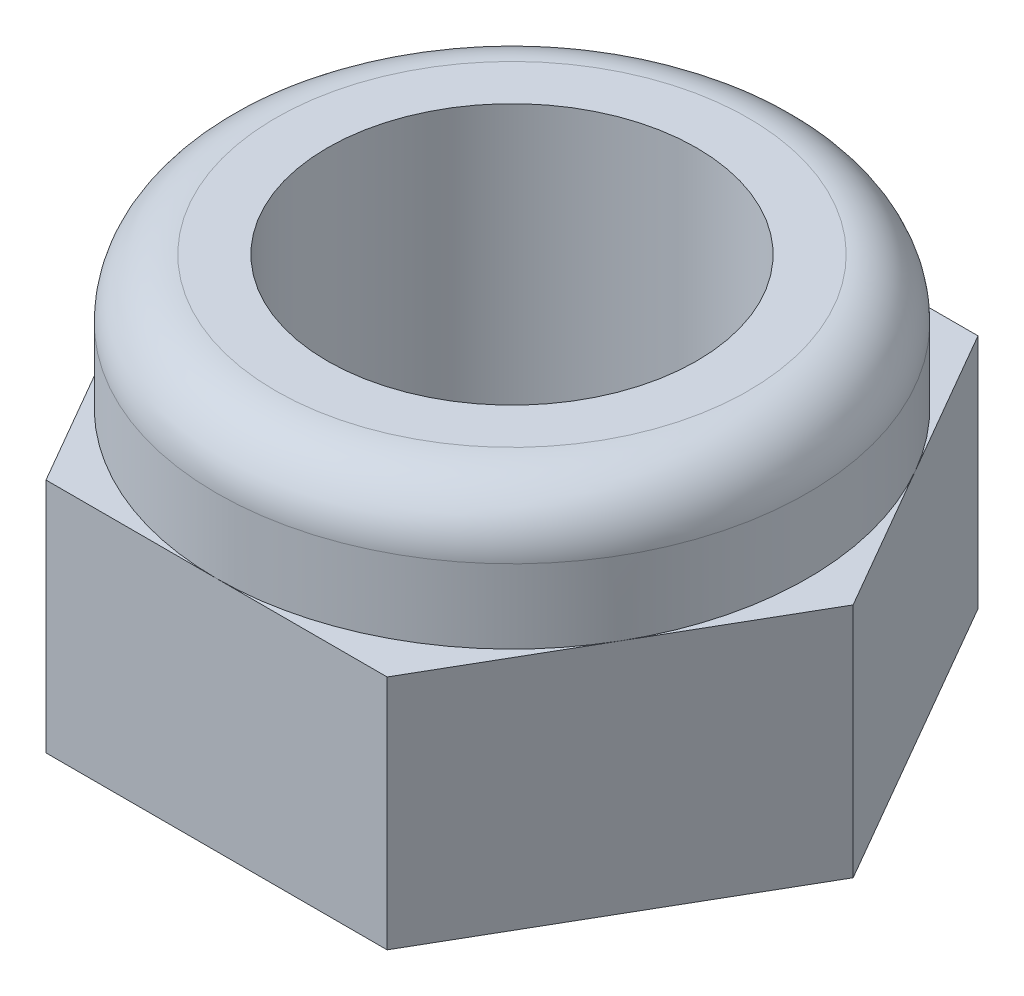
ISO-10303-21;
HEADER;
FILE_DESCRIPTION(('STEP AP214'),'2;1');
FILE_NAME('part.step','',(''),(''),'','','');
FILE_SCHEMA(('AUTOMOTIVE_DESIGN { 1 0 10303 214 1 1 1 1 }'));
ENDSEC;
DATA;
#1=APPLICATION_CONTEXT('core data for automotive mechanical design processes');
#2=APPLICATION_PROTOCOL_DEFINITION('international standard','automotive_design',2000,#1);
#3=PRODUCT_CONTEXT('',#1,'mechanical');
#4=PRODUCT('Part','Part','',(#3));
#5=PRODUCT_RELATED_PRODUCT_CATEGORY('part','',(#4));
#6=PRODUCT_DEFINITION_FORMATION('','',#4);
#7=PRODUCT_DEFINITION_CONTEXT('part definition',#1,'design');
#8=PRODUCT_DEFINITION('design','',#6,#7);
#9=PRODUCT_DEFINITION_SHAPE('','',#8);
#10=(LENGTH_UNIT() NAMED_UNIT(*) SI_UNIT(.MILLI.,.METRE.));
#11=(NAMED_UNIT(*) PLANE_ANGLE_UNIT() SI_UNIT($,.RADIAN.));
#12=(NAMED_UNIT(*) SI_UNIT($,.STERADIAN.) SOLID_ANGLE_UNIT());
#13=UNCERTAINTY_MEASURE_WITH_UNIT(LENGTH_MEASURE(1.E-05),#10,'distance_accuracy_value','');
#14=(GEOMETRIC_REPRESENTATION_CONTEXT(3) GLOBAL_UNCERTAINTY_ASSIGNED_CONTEXT((#13)) GLOBAL_UNIT_ASSIGNED_CONTEXT((#10,
#11,#12)) REPRESENTATION_CONTEXT('',''));
#15=CARTESIAN_POINT('',(0.,0.,0.));
#16=DIRECTION('',(0.,0.,1.));
#17=DIRECTION('',(1.,0.,0.));
#18=AXIS2_PLACEMENT_3D('',#15,#16,#17);
#19=CARTESIAN_POINT('',(0.,3.2,0.));
#20=DIRECTION('',(0.,1.,0.));
#21=DIRECTION('',(0.,0.,1.));
#22=AXIS2_PLACEMENT_3D('',#19,#20,#21);
#23=PLANE('',#22);
#24=CARTESIAN_POINT('',(0.,3.2,0.));
#25=DIRECTION('',(0.,1.,0.));
#26=DIRECTION('',(0.,0.,1.));
#27=AXIS2_PLACEMENT_3D('',#24,#25,#26);
#28=CIRCLE('',#27,4.00000000000002);
#29=CARTESIAN_POINT('',(0.,3.2,4.00000000000002));
#30=VERTEX_POINT('',#29);
#31=CARTESIAN_POINT('',(3.46410161513778,3.2,1.99999999999999));
#32=VERTEX_POINT('',#31);
#33=EDGE_CURVE('E125',#30,#32,#28,.T.);
#34=ORIENTED_EDGE('',*,*,#33,.F.);
#35=DIRECTION('',(1.,0.,0.));
#36=VECTOR('',#35,1.);
#37=CARTESIAN_POINT('',(-2.30940107675847,3.2,4.00000000000002));
#38=LINE('',#37,#36);
#39=CARTESIAN_POINT('',(2.30940107675855,3.2,3.99999999999998));
#40=VERTEX_POINT('',#39);
#41=EDGE_CURVE('E114',#30,#40,#38,.T.);
#42=ORIENTED_EDGE('',*,*,#41,.T.);
#43=DIRECTION('',(0.499999999999995,0.,-0.866025403784441));
#44=VECTOR('',#43,1.);
#45=CARTESIAN_POINT('',(2.30940107675855,3.2,3.99999999999998));
#46=LINE('',#45,#44);
#47=EDGE_CURVE('E126',#40,#32,#46,.T.);
#48=ORIENTED_EDGE('',*,*,#47,.T.);
#49=EDGE_LOOP('',(#34,#42,#48));
#50=FACE_BOUND('',#49,.T.);
#51=ADVANCED_FACE('F36',(#50),#23,.T.);
#52=CARTESIAN_POINT('',(3.46410161513775,3.2,-2.));
#53=VERTEX_POINT('',#52);
#54=EDGE_CURVE('E132',#32,#53,#28,.T.);
#55=ORIENTED_EDGE('',*,*,#54,.F.);
#56=CARTESIAN_POINT('',(4.61880215351701,3.2,0.));
#57=VERTEX_POINT('',#56);
#58=EDGE_CURVE('E146',#32,#57,#46,.T.);
#59=ORIENTED_EDGE('',*,*,#58,.T.);
#60=DIRECTION('',(-0.500000000000001,0.,-0.866025403784438));
#61=VECTOR('',#60,1.);
#62=CARTESIAN_POINT('',(4.61880215351701,3.2,0.));
#63=LINE('',#62,#61);
#64=EDGE_CURVE('E147',#57,#53,#63,.T.);
#65=ORIENTED_EDGE('',*,*,#64,.T.);
#66=EDGE_LOOP('',(#55,#59,#65));
#67=FACE_BOUND('',#66,.T.);
#68=ADVANCED_FACE('F227',(#67),#23,.T.);
#69=CARTESIAN_POINT('',(0.,3.2,-4.));
#70=VERTEX_POINT('',#69);
#71=EDGE_CURVE('E184',#53,#70,#28,.T.);
#72=ORIENTED_EDGE('',*,*,#71,.F.);
#73=CARTESIAN_POINT('',(2.3094010767585,3.2,-4.00000000000001));
#74=VERTEX_POINT('',#73);
#75=EDGE_CURVE('E145',#53,#74,#63,.T.);
#76=ORIENTED_EDGE('',*,*,#75,.T.);
#77=DIRECTION('',(-1.,0.,0.));
#78=VECTOR('',#77,1.);
#79=CARTESIAN_POINT('',(2.3094010767585,3.2,-4.00000000000001));
#80=LINE('',#79,#78);
#81=EDGE_CURVE('E151',#74,#70,#80,.T.);
#82=ORIENTED_EDGE('',*,*,#81,.T.);
#83=EDGE_LOOP('',(#72,#76,#82));
#84=FACE_BOUND('',#83,.T.);
#85=ADVANCED_FACE('F195',(#84),#23,.T.);
#86=CARTESIAN_POINT('',(-3.46410161513777,3.2,-1.99999999999998));
#87=VERTEX_POINT('',#86);
#88=EDGE_CURVE('E136',#70,#87,#28,.T.);
#89=ORIENTED_EDGE('',*,*,#88,.F.);
#90=CARTESIAN_POINT('',(-2.30940107675852,3.2,-3.99999999999999));
#91=VERTEX_POINT('',#90);
#92=EDGE_CURVE('E150',#70,#91,#80,.T.);
#93=ORIENTED_EDGE('',*,*,#92,.T.);
#94=DIRECTION('',(-0.499999999999995,0.,0.866025403784441));
#95=VECTOR('',#94,1.);
#96=CARTESIAN_POINT('',(-2.30940107675852,3.2,-3.99999999999999));
#97=LINE('',#96,#95);
#98=EDGE_CURVE('E155',#91,#87,#97,.T.);
#99=ORIENTED_EDGE('',*,*,#98,.T.);
#100=EDGE_LOOP('',(#89,#93,#99));
#101=FACE_BOUND('',#100,.T.);
#102=ADVANCED_FACE('F188',(#101),#23,.T.);
#103=CARTESIAN_POINT('',(-3.46410161513774,3.2,2.00000000000003));
#104=VERTEX_POINT('',#103);
#105=EDGE_CURVE('E59',#87,#104,#28,.T.);
#106=ORIENTED_EDGE('',*,*,#105,.F.);
#107=CARTESIAN_POINT('',(-4.61880215351701,3.2,0.));
#108=VERTEX_POINT('',#107);
#109=EDGE_CURVE('E154',#87,#108,#97,.T.);
#110=ORIENTED_EDGE('',*,*,#109,.T.);
#111=DIRECTION('',(0.500000000000007,0.,0.866025403784434));
#112=VECTOR('',#111,1.);
#113=CARTESIAN_POINT('',(-4.61880215351701,3.2,0.));
#114=LINE('',#113,#112);
#115=EDGE_CURVE('E123',#108,#104,#114,.T.);
#116=ORIENTED_EDGE('',*,*,#115,.T.);
#117=EDGE_LOOP('',(#106,#110,#116));
#118=FACE_BOUND('',#117,.T.);
#119=ADVANCED_FACE('F214',(#118),#23,.T.);
#120=CARTESIAN_POINT('',(2.30940107675855,3.2,3.99999999999998));
#121=DIRECTION('',(-0.866025403784441,0.,-0.499999999999995));
#122=DIRECTION('',(-0.499999999999995,0.,0.866025403784442));
#123=AXIS2_PLACEMENT_3D('',#120,#121,#122);
#124=PLANE('',#123);
#125=DIRECTION('',(0.499999999999995,0.,-0.866025403784441));
#126=VECTOR('',#125,1.);
#127=CARTESIAN_POINT('',(2.30940107675855,0.,3.99999999999998));
#128=LINE('',#127,#126);
#129=CARTESIAN_POINT('',(2.30940107675855,0.,3.99999999999998));
#130=VERTEX_POINT('',#129);
#131=CARTESIAN_POINT('',(4.61880215351701,0.,0.));
#132=VERTEX_POINT('',#131);
#133=EDGE_CURVE('E129',#130,#132,#128,.T.);
#134=ORIENTED_EDGE('',*,*,#133,.T.);
#135=DIRECTION('',(0.,-1.,0.));
#136=VECTOR('',#135,1.);
#137=CARTESIAN_POINT('',(4.61880215351701,3.2,0.));
#138=LINE('',#137,#136);
#139=EDGE_CURVE('E135',#57,#132,#138,.T.);
#140=ORIENTED_EDGE('',*,*,#139,.F.);
#141=ORIENTED_EDGE('',*,*,#58,.F.);
#142=ORIENTED_EDGE('',*,*,#47,.F.);
#143=DIRECTION('',(0.,-1.,0.));
#144=VECTOR('',#143,1.);
#145=CARTESIAN_POINT('',(2.30940107675855,3.2,3.99999999999998));
#146=LINE('',#145,#144);
#147=EDGE_CURVE('E113',#40,#130,#146,.T.);
#148=ORIENTED_EDGE('',*,*,#147,.T.);
#149=EDGE_LOOP('',(#134,#140,#141,#142,#148));
#150=FACE_BOUND('',#149,.T.);
#151=ADVANCED_FACE('F216',(#150),#124,.F.);
#152=CARTESIAN_POINT('',(4.61880215351701,3.2,0.));
#153=DIRECTION('',(-0.866025403784438,0.,0.500000000000001));
#154=DIRECTION('',(0.500000000000001,0.,0.866025403784438));
#155=AXIS2_PLACEMENT_3D('',#152,#153,#154);
#156=PLANE('',#155);
#157=DIRECTION('',(-0.500000000000001,0.,-0.866025403784438));
#158=VECTOR('',#157,1.);
#159=CARTESIAN_POINT('',(4.61880215351701,0.,0.));
#160=LINE('',#159,#158);
#161=CARTESIAN_POINT('',(2.3094010767585,0.,-4.00000000000001));
#162=VERTEX_POINT('',#161);
#163=EDGE_CURVE('E161',#132,#162,#160,.T.);
#164=ORIENTED_EDGE('',*,*,#163,.T.);
#165=DIRECTION('',(0.,-1.,0.));
#166=VECTOR('',#165,1.);
#167=CARTESIAN_POINT('',(2.3094010767585,3.2,-4.00000000000001));
#168=LINE('',#167,#166);
#169=EDGE_CURVE('E138',#74,#162,#168,.T.);
#170=ORIENTED_EDGE('',*,*,#169,.F.);
#171=ORIENTED_EDGE('',*,*,#75,.F.);
#172=ORIENTED_EDGE('',*,*,#64,.F.);
#173=ORIENTED_EDGE('',*,*,#139,.T.);
#174=EDGE_LOOP('',(#164,#170,#171,#172,#173));
#175=FACE_BOUND('',#174,.T.);
#176=ADVANCED_FACE('F200',(#175),#156,.F.);
#177=CARTESIAN_POINT('',(2.3094010767585,3.2,-4.00000000000001));
#178=DIRECTION('',(0.,0.,1.));
#179=DIRECTION('',(1.,0.,0.));
#180=AXIS2_PLACEMENT_3D('',#177,#178,#179);
#181=PLANE('',#180);
#182=DIRECTION('',(-1.,0.,0.));
#183=VECTOR('',#182,1.);
#184=CARTESIAN_POINT('',(2.3094010767585,0.,-4.00000000000001));
#185=LINE('',#184,#183);
#186=CARTESIAN_POINT('',(-2.30940107675852,0.,-3.99999999999999));
#187=VERTEX_POINT('',#186);
#188=EDGE_CURVE('E163',#162,#187,#185,.T.);
#189=ORIENTED_EDGE('',*,*,#188,.T.);
#190=DIRECTION('',(0.,-1.,0.));
#191=VECTOR('',#190,1.);
#192=CARTESIAN_POINT('',(-2.30940107675852,3.2,-3.99999999999999));
#193=LINE('',#192,#191);
#194=EDGE_CURVE('E177',#91,#187,#193,.T.);
#195=ORIENTED_EDGE('',*,*,#194,.F.);
#196=ORIENTED_EDGE('',*,*,#92,.F.);
#197=ORIENTED_EDGE('',*,*,#81,.F.);
#198=ORIENTED_EDGE('',*,*,#169,.T.);
#199=EDGE_LOOP('',(#189,#195,#196,#197,#198));
#200=FACE_BOUND('',#199,.T.);
#201=ADVANCED_FACE('F193',(#200),#181,.F.);
#202=CARTESIAN_POINT('',(-2.30940107675852,3.2,-3.99999999999999));
#203=DIRECTION('',(0.866025403784441,0.,0.499999999999995));
#204=DIRECTION('',(0.499999999999995,0.,-0.866025403784441));
#205=AXIS2_PLACEMENT_3D('',#202,#203,#204);
#206=PLANE('',#205);
#207=DIRECTION('',(-0.499999999999995,0.,0.866025403784441));
#208=VECTOR('',#207,1.);
#209=CARTESIAN_POINT('',(-2.30940107675852,0.,-3.99999999999999));
#210=LINE('',#209,#208);
#211=CARTESIAN_POINT('',(-4.61880215351701,0.,0.));
#212=VERTEX_POINT('',#211);
#213=EDGE_CURVE('E165',#187,#212,#210,.T.);
#214=ORIENTED_EDGE('',*,*,#213,.T.);
#215=DIRECTION('',(0.,-1.,0.));
#216=VECTOR('',#215,1.);
#217=CARTESIAN_POINT('',(-4.61880215351701,3.2,0.));
#218=LINE('',#217,#216);
#219=EDGE_CURVE('E174',#108,#212,#218,.T.);
#220=ORIENTED_EDGE('',*,*,#219,.F.);
#221=ORIENTED_EDGE('',*,*,#109,.F.);
#222=ORIENTED_EDGE('',*,*,#98,.F.);
#223=ORIENTED_EDGE('',*,*,#194,.T.);
#224=EDGE_LOOP('',(#214,#220,#221,#222,#223));
#225=FACE_BOUND('',#224,.T.);
#226=ADVANCED_FACE('F210',(#225),#206,.F.);
#227=CARTESIAN_POINT('',(-4.61880215351701,3.2,0.));
#228=DIRECTION('',(0.866025403784435,0.,-0.500000000000007));
#229=DIRECTION('',(-0.500000000000007,0.,-0.866025403784435));
#230=AXIS2_PLACEMENT_3D('',#227,#228,#229);
#231=PLANE('',#230);
#232=DIRECTION('',(0.500000000000007,0.,0.866025403784434));
#233=VECTOR('',#232,1.);
#234=CARTESIAN_POINT('',(-4.61880215351701,0.,0.));
#235=LINE('',#234,#233);
#236=CARTESIAN_POINT('',(-2.30940107675847,0.,4.00000000000002));
#237=VERTEX_POINT('',#236);
#238=EDGE_CURVE('E167',#212,#237,#235,.T.);
#239=ORIENTED_EDGE('',*,*,#238,.T.);
#240=DIRECTION('',(0.,-1.,0.));
#241=VECTOR('',#240,1.);
#242=CARTESIAN_POINT('',(-2.30940107675847,3.2,4.00000000000002));
#243=LINE('',#242,#241);
#244=CARTESIAN_POINT('',(-2.30940107675847,3.2,4.00000000000002));
#245=VERTEX_POINT('',#244);
#246=EDGE_CURVE('E172',#245,#237,#243,.T.);
#247=ORIENTED_EDGE('',*,*,#246,.F.);
#248=EDGE_CURVE('E109',#104,#245,#114,.T.);
#249=ORIENTED_EDGE('',*,*,#248,.F.);
#250=ORIENTED_EDGE('',*,*,#115,.F.);
#251=ORIENTED_EDGE('',*,*,#219,.T.);
#252=EDGE_LOOP('',(#239,#247,#249,#250,#251));
#253=FACE_BOUND('',#252,.T.);
#254=ADVANCED_FACE('F213',(#253),#231,.F.);
#255=CARTESIAN_POINT('',(-2.30940107675847,3.2,4.00000000000002));
#256=DIRECTION('',(0.,0.,-1.));
#257=DIRECTION('',(-1.,0.,0.));
#258=AXIS2_PLACEMENT_3D('',#255,#256,#257);
#259=PLANE('',#258);
#260=DIRECTION('',(1.,0.,0.));
#261=VECTOR('',#260,1.);
#262=CARTESIAN_POINT('',(-2.30940107675847,0.,4.00000000000002));
#263=LINE('',#262,#261);
#264=EDGE_CURVE('E169',#237,#130,#263,.T.);
#265=ORIENTED_EDGE('',*,*,#264,.T.);
#266=ORIENTED_EDGE('',*,*,#147,.F.);
#267=ORIENTED_EDGE('',*,*,#41,.F.);
#268=EDGE_CURVE('E106',#245,#30,#38,.T.);
#269=ORIENTED_EDGE('',*,*,#268,.F.);
#270=ORIENTED_EDGE('',*,*,#246,.T.);
#271=EDGE_LOOP('',(#265,#266,#267,#269,#270));
#272=FACE_BOUND('',#271,.T.);
#273=ADVANCED_FACE('F118',(#272),#259,.F.);
#274=EDGE_CURVE('E51',#104,#30,#28,.T.);
#275=ORIENTED_EDGE('',*,*,#274,.F.);
#276=ORIENTED_EDGE('',*,*,#248,.T.);
#277=ORIENTED_EDGE('',*,*,#268,.T.);
#278=EDGE_LOOP('',(#275,#276,#277));
#279=FACE_BOUND('',#278,.T.);
#280=ADVANCED_FACE('F108',(#279),#23,.T.);
#281=CARTESIAN_POINT('',(0.,0.,0.));
#282=DIRECTION('',(0.,1.,0.));
#283=DIRECTION('',(0.,0.,1.));
#284=AXIS2_PLACEMENT_3D('',#281,#282,#283);
#285=PLANE('',#284);
#286=CARTESIAN_POINT('',(0.,0.,0.));
#287=DIRECTION('',(0.,1.,0.));
#288=DIRECTION('',(0.,0.,1.));
#289=AXIS2_PLACEMENT_3D('',#286,#287,#288);
#290=CIRCLE('',#289,2.5);
#291=CARTESIAN_POINT('',(0.,0.,2.5));
#292=VERTEX_POINT('',#291);
#293=EDGE_CURVE('E130',#292,#292,#290,.T.);
#294=ORIENTED_EDGE('',*,*,#293,.T.);
#295=EDGE_LOOP('',(#294));
#296=FACE_BOUND('',#295,.T.);
#297=ORIENTED_EDGE('',*,*,#133,.F.);
#298=ORIENTED_EDGE('',*,*,#264,.F.);
#299=ORIENTED_EDGE('',*,*,#238,.F.);
#300=ORIENTED_EDGE('',*,*,#213,.F.);
#301=ORIENTED_EDGE('',*,*,#188,.F.);
#302=ORIENTED_EDGE('',*,*,#163,.F.);
#303=EDGE_LOOP('',(#297,#298,#299,#300,#301,#302));
#304=FACE_BOUND('',#303,.T.);
#305=ADVANCED_FACE('F205',(#296,#304),#285,.F.);
#306=CARTESIAN_POINT('',(0.,21.3137084989848,0.));
#307=DIRECTION('',(0.,-1.,0.));
#308=DIRECTION('',(0.,0.,-1.));
#309=AXIS2_PLACEMENT_3D('',#306,#307,#308);
#310=CYLINDRICAL_SURFACE('',#309,4.00000000000002);
#311=CARTESIAN_POINT('',(0.,4.2,0.));
#312=DIRECTION('',(0.,1.,0.));
#313=DIRECTION('',(0.,0.,1.));
#314=AXIS2_PLACEMENT_3D('',#311,#312,#313);
#315=CIRCLE('',#314,4.00000000000002);
#316=CARTESIAN_POINT('',(0.,4.2,4.00000000000002));
#317=VERTEX_POINT('',#316);
#318=EDGE_CURVE('E12',#317,#317,#315,.F.);
#319=ORIENTED_EDGE('',*,*,#318,.T.);
#320=EDGE_LOOP('',(#319));
#321=FACE_BOUND('',#320,.T.);
#322=ORIENTED_EDGE('',*,*,#33,.T.);
#323=ORIENTED_EDGE('',*,*,#54,.T.);
#324=ORIENTED_EDGE('',*,*,#71,.T.);
#325=ORIENTED_EDGE('',*,*,#88,.T.);
#326=ORIENTED_EDGE('',*,*,#105,.T.);
#327=ORIENTED_EDGE('',*,*,#274,.T.);
#328=EDGE_LOOP('',(#322,#323,#324,#325,#326,#327));
#329=FACE_BOUND('',#328,.T.);
#330=ADVANCED_FACE('F133',(#321,#329),#310,.T.);
#331=CARTESIAN_POINT('',(0.,5.,0.));
#332=DIRECTION('',(0.,1.,0.));
#333=DIRECTION('',(0.,0.,1.));
#334=AXIS2_PLACEMENT_3D('',#331,#332,#333);
#335=PLANE('',#334);
#336=CARTESIAN_POINT('',(0.,5.,0.));
#337=DIRECTION('',(0.,1.,0.));
#338=DIRECTION('',(0.,0.,1.));
#339=AXIS2_PLACEMENT_3D('',#336,#337,#338);
#340=CIRCLE('',#339,3.20000000000002);
#341=CARTESIAN_POINT('',(0.,5.,3.20000000000002));
#342=VERTEX_POINT('',#341);
#343=EDGE_CURVE('E44',#342,#342,#340,.T.);
#344=ORIENTED_EDGE('',*,*,#343,.T.);
#345=EDGE_LOOP('',(#344));
#346=FACE_BOUND('',#345,.T.);
#347=CARTESIAN_POINT('',(0.,5.,0.));
#348=DIRECTION('',(0.,1.,0.));
#349=DIRECTION('',(0.,0.,1.));
#350=AXIS2_PLACEMENT_3D('',#347,#348,#349);
#351=CIRCLE('',#350,2.5);
#352=CARTESIAN_POINT('',(0.,5.,2.5));
#353=VERTEX_POINT('',#352);
#354=EDGE_CURVE('E142',#353,#353,#351,.T.);
#355=ORIENTED_EDGE('',*,*,#354,.F.);
#356=EDGE_LOOP('',(#355));
#357=FACE_BOUND('',#356,.T.);
#358=ADVANCED_FACE('F317',(#346,#357),#335,.T.);
#359=CARTESIAN_POINT('',(0.,0.,0.));
#360=DIRECTION('',(0.,1.,0.));
#361=DIRECTION('',(0.,0.,1.));
#362=AXIS2_PLACEMENT_3D('',#359,#360,#361);
#363=CYLINDRICAL_SURFACE('',#362,2.5);
#364=ORIENTED_EDGE('',*,*,#293,.F.);
#365=EDGE_LOOP('',(#364));
#366=FACE_BOUND('',#365,.T.);
#367=ORIENTED_EDGE('',*,*,#354,.T.);
#368=EDGE_LOOP('',(#367));
#369=FACE_BOUND('',#368,.T.);
#370=ADVANCED_FACE('F327',(#366,#369),#363,.F.);
#371=CARTESIAN_POINT('',(0.,4.2,0.));
#372=DIRECTION('',(0.,1.,0.));
#373=DIRECTION('',(0.,0.,1.));
#374=AXIS2_PLACEMENT_3D('',#371,#372,#373);
#375=TOROIDAL_SURFACE('',#374,3.20000000000002,0.8);
#376=ORIENTED_EDGE('',*,*,#318,.F.);
#377=EDGE_LOOP('',(#376));
#378=FACE_BOUND('',#377,.T.);
#379=ORIENTED_EDGE('',*,*,#343,.F.);
#380=EDGE_LOOP('',(#379));
#381=FACE_BOUND('',#380,.T.);
#382=ADVANCED_FACE('F38',(#378,#381),#375,.T.);
#383=CLOSED_SHELL('',(#51,#68,#85,#102,#119,#151,#176,#201,#226,#254,#273,#280,#305,#330,#358,
#370,#382));
#384=MANIFOLD_SOLID_BREP('B2',#383);
#385=ADVANCED_BREP_SHAPE_REPRESENTATION('',(#18,#384),#14);
#386=SHAPE_DEFINITION_REPRESENTATION(#9,#385);
ENDSEC;
END-ISO-10303-21;
